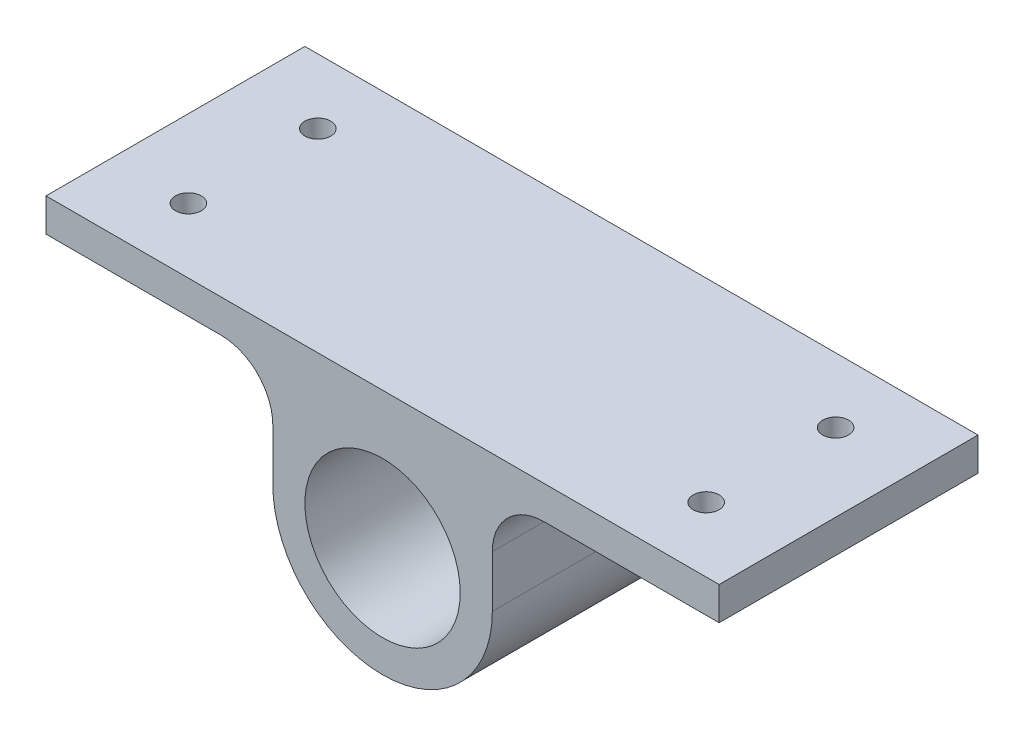
ISO-10303-21;
HEADER;
FILE_DESCRIPTION(('STEP AP214'),'2;1');
FILE_NAME('part.step','',(''),(''),'','','');
FILE_SCHEMA(('AUTOMOTIVE_DESIGN { 1 0 10303 214 1 1 1 1 }'));
ENDSEC;
DATA;
#1=APPLICATION_CONTEXT('core data for automotive mechanical design processes');
#2=APPLICATION_PROTOCOL_DEFINITION('international standard','automotive_design',2000,#1);
#3=PRODUCT_CONTEXT('',#1,'mechanical');
#4=PRODUCT('Part','Part','',(#3));
#5=PRODUCT_RELATED_PRODUCT_CATEGORY('part','',(#4));
#6=PRODUCT_DEFINITION_FORMATION('','',#4);
#7=PRODUCT_DEFINITION_CONTEXT('part definition',#1,'design');
#8=PRODUCT_DEFINITION('design','',#6,#7);
#9=PRODUCT_DEFINITION_SHAPE('','',#8);
#10=(LENGTH_UNIT() NAMED_UNIT(*) SI_UNIT(.MILLI.,.METRE.));
#11=(NAMED_UNIT(*) PLANE_ANGLE_UNIT() SI_UNIT($,.RADIAN.));
#12=(NAMED_UNIT(*) SI_UNIT($,.STERADIAN.) SOLID_ANGLE_UNIT());
#13=UNCERTAINTY_MEASURE_WITH_UNIT(LENGTH_MEASURE(1.E-05),#10,'distance_accuracy_value','');
#14=(GEOMETRIC_REPRESENTATION_CONTEXT(3) GLOBAL_UNCERTAINTY_ASSIGNED_CONTEXT((#13)) GLOBAL_UNIT_ASSIGNED_CONTEXT((#10,
#11,#12)) REPRESENTATION_CONTEXT('',''));
#15=CARTESIAN_POINT('',(0.,0.,0.));
#16=DIRECTION('',(0.,0.,1.));
#17=DIRECTION('',(1.,0.,0.));
#18=AXIS2_PLACEMENT_3D('',#15,#16,#17);
#19=CARTESIAN_POINT('',(0.,0.,125.));
#20=DIRECTION('',(0.,0.,1.));
#21=DIRECTION('',(1.,0.,0.));
#22=AXIS2_PLACEMENT_3D('',#19,#20,#21);
#23=PLANE('',#22);
#24=CARTESIAN_POINT('',(0.,0.,125.));
#25=DIRECTION('',(0.,0.,1.));
#26=DIRECTION('',(1.,0.,0.));
#27=AXIS2_PLACEMENT_3D('',#24,#25,#26);
#28=CIRCLE('',#27,106.);
#29=CARTESIAN_POINT('',(-106.,0.,125.));
#30=VERTEX_POINT('',#29);
#31=CARTESIAN_POINT('',(106.,1.11022302462516E-13,125.));
#32=VERTEX_POINT('',#31);
#33=EDGE_CURVE('E167',#30,#32,#28,.T.);
#34=ORIENTED_EDGE('',*,*,#33,.T.);
#35=DIRECTION('',(0.,1.,0.));
#36=VECTOR('',#35,1.);
#37=CARTESIAN_POINT('',(106.,1.11022302462516E-13,125.));
#38=LINE('',#37,#36);
#39=CARTESIAN_POINT('',(106.,50.0000000000001,125.));
#40=VERTEX_POINT('',#39);
#41=EDGE_CURVE('E105',#32,#40,#38,.T.);
#42=ORIENTED_EDGE('',*,*,#41,.T.);
#43=CARTESIAN_POINT('',(156.,50.0000000000001,125.));
#44=DIRECTION('',(0.,0.,-1.));
#45=DIRECTION('',(-1.,0.,0.));
#46=AXIS2_PLACEMENT_3D('',#43,#44,#45);
#47=CIRCLE('',#46,50.);
#48=CARTESIAN_POINT('',(156.,100.,125.));
#49=VERTEX_POINT('',#48);
#50=EDGE_CURVE('E215',#40,#49,#47,.T.);
#51=ORIENTED_EDGE('',*,*,#50,.T.);
#52=DIRECTION('',(1.,0.,0.));
#53=VECTOR('',#52,1.);
#54=CARTESIAN_POINT('',(156.,100.,125.));
#55=LINE('',#54,#53);
#56=CARTESIAN_POINT('',(325.,100.,125.));
#57=VERTEX_POINT('',#56);
#58=EDGE_CURVE('E217',#49,#57,#55,.T.);
#59=ORIENTED_EDGE('',*,*,#58,.T.);
#60=DIRECTION('',(0.,1.,0.));
#61=VECTOR('',#60,1.);
#62=CARTESIAN_POINT('',(325.,100.,125.));
#63=LINE('',#62,#61);
#64=CARTESIAN_POINT('',(325.,132.,125.));
#65=VERTEX_POINT('',#64);
#66=EDGE_CURVE('E219',#57,#65,#63,.T.);
#67=ORIENTED_EDGE('',*,*,#66,.T.);
#68=DIRECTION('',(-1.,0.,0.));
#69=VECTOR('',#68,1.);
#70=CARTESIAN_POINT('',(-325.,132.,125.));
#71=LINE('',#70,#69);
#72=CARTESIAN_POINT('',(-325.,132.,125.));
#73=VERTEX_POINT('',#72);
#74=EDGE_CURVE('E221',#65,#73,#71,.T.);
#75=ORIENTED_EDGE('',*,*,#74,.T.);
#76=DIRECTION('',(0.,-1.,0.));
#77=VECTOR('',#76,1.);
#78=CARTESIAN_POINT('',(-325.,100.,125.));
#79=LINE('',#78,#77);
#80=CARTESIAN_POINT('',(-325.,100.,125.));
#81=VERTEX_POINT('',#80);
#82=EDGE_CURVE('E130',#73,#81,#79,.T.);
#83=ORIENTED_EDGE('',*,*,#82,.T.);
#84=DIRECTION('',(1.,0.,0.));
#85=VECTOR('',#84,1.);
#86=CARTESIAN_POINT('',(-156.,100.,125.));
#87=LINE('',#86,#85);
#88=CARTESIAN_POINT('',(-156.,100.,125.));
#89=VERTEX_POINT('',#88);
#90=EDGE_CURVE('E124',#81,#89,#87,.T.);
#91=ORIENTED_EDGE('',*,*,#90,.T.);
#92=CARTESIAN_POINT('',(-156.,50.,125.));
#93=DIRECTION('',(0.,0.,-1.));
#94=DIRECTION('',(1.,0.,0.));
#95=AXIS2_PLACEMENT_3D('',#92,#93,#94);
#96=CIRCLE('',#95,50.);
#97=CARTESIAN_POINT('',(-106.,50.,125.));
#98=VERTEX_POINT('',#97);
#99=EDGE_CURVE('E128',#89,#98,#96,.T.);
#100=ORIENTED_EDGE('',*,*,#99,.T.);
#101=DIRECTION('',(0.,-1.,0.));
#102=VECTOR('',#101,1.);
#103=CARTESIAN_POINT('',(-106.,0.,125.));
#104=LINE('',#103,#102);
#105=EDGE_CURVE('E56',#98,#30,#104,.T.);
#106=ORIENTED_EDGE('',*,*,#105,.T.);
#107=EDGE_LOOP('',(#34,#42,#51,#59,#67,#75,#83,#91,#100,#106));
#108=FACE_BOUND('',#107,.T.);
#109=CARTESIAN_POINT('',(0.,0.,125.));
#110=DIRECTION('',(0.,0.,1.));
#111=DIRECTION('',(1.,0.,0.));
#112=AXIS2_PLACEMENT_3D('',#109,#110,#111);
#113=CIRCLE('',#112,75.);
#114=CARTESIAN_POINT('',(75.,0.,125.));
#115=VERTEX_POINT('',#114);
#116=EDGE_CURVE('E152',#115,#115,#113,.T.);
#117=ORIENTED_EDGE('',*,*,#116,.F.);
#118=EDGE_LOOP('',(#117));
#119=FACE_BOUND('',#118,.T.);
#120=ADVANCED_FACE('F37',(#108,#119),#23,.T.);
#121=CARTESIAN_POINT('',(0.,0.,-125.));
#122=DIRECTION('',(0.,0.,1.));
#123=DIRECTION('',(1.,0.,0.));
#124=AXIS2_PLACEMENT_3D('',#121,#122,#123);
#125=PLANE('',#124);
#126=CARTESIAN_POINT('',(0.,0.,-125.));
#127=DIRECTION('',(0.,0.,1.));
#128=DIRECTION('',(1.,0.,0.));
#129=AXIS2_PLACEMENT_3D('',#126,#127,#128);
#130=CIRCLE('',#129,106.);
#131=CARTESIAN_POINT('',(-106.,0.,-125.));
#132=VERTEX_POINT('',#131);
#133=CARTESIAN_POINT('',(106.,1.11022302462516E-13,-125.));
#134=VERTEX_POINT('',#133);
#135=EDGE_CURVE('E148',#132,#134,#130,.T.);
#136=ORIENTED_EDGE('',*,*,#135,.F.);
#137=DIRECTION('',(0.,-1.,0.));
#138=VECTOR('',#137,1.);
#139=CARTESIAN_POINT('',(-106.,0.,-125.));
#140=LINE('',#139,#138);
#141=CARTESIAN_POINT('',(-106.,50.,-125.));
#142=VERTEX_POINT('',#141);
#143=EDGE_CURVE('E97',#142,#132,#140,.T.);
#144=ORIENTED_EDGE('',*,*,#143,.F.);
#145=CARTESIAN_POINT('',(-156.,50.,-125.));
#146=DIRECTION('',(0.,0.,-1.));
#147=DIRECTION('',(1.,0.,0.));
#148=AXIS2_PLACEMENT_3D('',#145,#146,#147);
#149=CIRCLE('',#148,50.);
#150=CARTESIAN_POINT('',(-156.,100.,-125.));
#151=VERTEX_POINT('',#150);
#152=EDGE_CURVE('E91',#151,#142,#149,.T.);
#153=ORIENTED_EDGE('',*,*,#152,.F.);
#154=DIRECTION('',(1.,0.,0.));
#155=VECTOR('',#154,1.);
#156=CARTESIAN_POINT('',(-156.,100.,-125.));
#157=LINE('',#156,#155);
#158=CARTESIAN_POINT('',(-325.,100.,-125.));
#159=VERTEX_POINT('',#158);
#160=EDGE_CURVE('E138',#159,#151,#157,.T.);
#161=ORIENTED_EDGE('',*,*,#160,.F.);
#162=DIRECTION('',(0.,-1.,0.));
#163=VECTOR('',#162,1.);
#164=CARTESIAN_POINT('',(-325.,100.,-125.));
#165=LINE('',#164,#163);
#166=CARTESIAN_POINT('',(-325.,132.,-125.));
#167=VERTEX_POINT('',#166);
#168=EDGE_CURVE('E162',#167,#159,#165,.T.);
#169=ORIENTED_EDGE('',*,*,#168,.F.);
#170=DIRECTION('',(-1.,0.,0.));
#171=VECTOR('',#170,1.);
#172=CARTESIAN_POINT('',(-325.,132.,-125.));
#173=LINE('',#172,#171);
#174=CARTESIAN_POINT('',(325.,132.,-125.));
#175=VERTEX_POINT('',#174);
#176=EDGE_CURVE('E160',#175,#167,#173,.T.);
#177=ORIENTED_EDGE('',*,*,#176,.F.);
#178=DIRECTION('',(0.,1.,0.));
#179=VECTOR('',#178,1.);
#180=CARTESIAN_POINT('',(325.,100.,-125.));
#181=LINE('',#180,#179);
#182=CARTESIAN_POINT('',(325.,100.,-125.));
#183=VERTEX_POINT('',#182);
#184=EDGE_CURVE('E158',#183,#175,#181,.T.);
#185=ORIENTED_EDGE('',*,*,#184,.F.);
#186=DIRECTION('',(1.,0.,0.));
#187=VECTOR('',#186,1.);
#188=CARTESIAN_POINT('',(156.,100.,-125.));
#189=LINE('',#188,#187);
#190=CARTESIAN_POINT('',(156.,100.,-125.));
#191=VERTEX_POINT('',#190);
#192=EDGE_CURVE('E156',#191,#183,#189,.T.);
#193=ORIENTED_EDGE('',*,*,#192,.F.);
#194=CARTESIAN_POINT('',(156.,50.0000000000001,-125.));
#195=DIRECTION('',(0.,0.,-1.));
#196=DIRECTION('',(-1.,0.,0.));
#197=AXIS2_PLACEMENT_3D('',#194,#195,#196);
#198=CIRCLE('',#197,50.);
#199=CARTESIAN_POINT('',(106.,50.0000000000001,-125.));
#200=VERTEX_POINT('',#199);
#201=EDGE_CURVE('E154',#200,#191,#198,.T.);
#202=ORIENTED_EDGE('',*,*,#201,.F.);
#203=DIRECTION('',(0.,1.,0.));
#204=VECTOR('',#203,1.);
#205=CARTESIAN_POINT('',(106.,1.11022302462516E-13,-125.));
#206=LINE('',#205,#204);
#207=EDGE_CURVE('E151',#134,#200,#206,.T.);
#208=ORIENTED_EDGE('',*,*,#207,.F.);
#209=EDGE_LOOP('',(#136,#144,#153,#161,#169,#177,#185,#193,#202,#208));
#210=FACE_BOUND('',#209,.T.);
#211=CARTESIAN_POINT('',(0.,0.,-125.));
#212=DIRECTION('',(0.,0.,1.));
#213=DIRECTION('',(1.,0.,0.));
#214=AXIS2_PLACEMENT_3D('',#211,#212,#213);
#215=CIRCLE('',#214,75.);
#216=CARTESIAN_POINT('',(75.,0.,-125.));
#217=VERTEX_POINT('',#216);
#218=EDGE_CURVE('E208',#217,#217,#215,.T.);
#219=ORIENTED_EDGE('',*,*,#218,.T.);
#220=EDGE_LOOP('',(#219));
#221=FACE_BOUND('',#220,.T.);
#222=ADVANCED_FACE('F234',(#210,#221),#125,.F.);
#223=CARTESIAN_POINT('',(0.,0.,125.));
#224=DIRECTION('',(0.,0.,-1.));
#225=DIRECTION('',(-1.,0.,0.));
#226=AXIS2_PLACEMENT_3D('',#223,#224,#225);
#227=CYLINDRICAL_SURFACE('',#226,106.);
#228=ORIENTED_EDGE('',*,*,#135,.T.);
#229=DIRECTION('',(0.,0.,-1.));
#230=VECTOR('',#229,1.);
#231=CARTESIAN_POINT('',(106.,1.11022302462516E-13,125.));
#232=LINE('',#231,#230);
#233=EDGE_CURVE('E11',#32,#134,#232,.T.);
#234=ORIENTED_EDGE('',*,*,#233,.F.);
#235=ORIENTED_EDGE('',*,*,#33,.F.);
#236=DIRECTION('',(0.,0.,-1.));
#237=VECTOR('',#236,1.);
#238=CARTESIAN_POINT('',(-106.,0.,125.));
#239=LINE('',#238,#237);
#240=EDGE_CURVE('E144',#30,#132,#239,.T.);
#241=ORIENTED_EDGE('',*,*,#240,.T.);
#242=EDGE_LOOP('',(#228,#234,#235,#241));
#243=FACE_BOUND('',#242,.T.);
#244=ADVANCED_FACE('F39',(#243),#227,.T.);
#245=CARTESIAN_POINT('',(106.,1.11022302462516E-13,125.));
#246=DIRECTION('',(-1.,0.,0.));
#247=DIRECTION('',(0.,-1.,0.));
#248=AXIS2_PLACEMENT_3D('',#245,#246,#247);
#249=PLANE('',#248);
#250=ORIENTED_EDGE('',*,*,#207,.T.);
#251=DIRECTION('',(0.,0.,-1.));
#252=VECTOR('',#251,1.);
#253=CARTESIAN_POINT('',(106.,50.0000000000001,125.));
#254=LINE('',#253,#252);
#255=EDGE_CURVE('E47',#40,#200,#254,.T.);
#256=ORIENTED_EDGE('',*,*,#255,.F.);
#257=ORIENTED_EDGE('',*,*,#41,.F.);
#258=ORIENTED_EDGE('',*,*,#233,.T.);
#259=EDGE_LOOP('',(#250,#256,#257,#258));
#260=FACE_BOUND('',#259,.T.);
#261=ADVANCED_FACE('F301',(#260),#249,.F.);
#262=CARTESIAN_POINT('',(156.,50.0000000000001,125.));
#263=DIRECTION('',(0.,0.,-1.));
#264=DIRECTION('',(-1.,0.,0.));
#265=AXIS2_PLACEMENT_3D('',#262,#263,#264);
#266=CYLINDRICAL_SURFACE('',#265,50.);
#267=ORIENTED_EDGE('',*,*,#201,.T.);
#268=DIRECTION('',(0.,0.,-1.));
#269=VECTOR('',#268,1.);
#270=CARTESIAN_POINT('',(156.,100.,125.));
#271=LINE('',#270,#269);
#272=EDGE_CURVE('E180',#49,#191,#271,.T.);
#273=ORIENTED_EDGE('',*,*,#272,.F.);
#274=ORIENTED_EDGE('',*,*,#50,.F.);
#275=ORIENTED_EDGE('',*,*,#255,.T.);
#276=EDGE_LOOP('',(#267,#273,#274,#275));
#277=FACE_BOUND('',#276,.T.);
#278=ADVANCED_FACE('F282',(#277),#266,.F.);
#279=CARTESIAN_POINT('',(156.,100.,125.));
#280=DIRECTION('',(0.,1.,0.));
#281=DIRECTION('',(0.,0.,1.));
#282=AXIS2_PLACEMENT_3D('',#279,#280,#281);
#283=PLANE('',#282);
#284=CARTESIAN_POINT('',(250.,100.,62.5));
#285=DIRECTION('',(0.,1.,0.));
#286=DIRECTION('',(0.,0.,1.));
#287=AXIS2_PLACEMENT_3D('',#284,#285,#286);
#288=CIRCLE('',#287,12.5);
#289=CARTESIAN_POINT('',(250.,100.,75.));
#290=VERTEX_POINT('',#289);
#291=EDGE_CURVE('E205',#290,#290,#288,.T.);
#292=ORIENTED_EDGE('',*,*,#291,.T.);
#293=EDGE_LOOP('',(#292));
#294=FACE_BOUND('',#293,.T.);
#295=CARTESIAN_POINT('',(250.,100.,-62.5));
#296=DIRECTION('',(0.,1.,0.));
#297=DIRECTION('',(0.,0.,1.));
#298=AXIS2_PLACEMENT_3D('',#295,#296,#297);
#299=CIRCLE('',#298,12.5);
#300=CARTESIAN_POINT('',(250.,100.,-50.));
#301=VERTEX_POINT('',#300);
#302=EDGE_CURVE('E190',#301,#301,#299,.T.);
#303=ORIENTED_EDGE('',*,*,#302,.T.);
#304=EDGE_LOOP('',(#303));
#305=FACE_BOUND('',#304,.T.);
#306=ORIENTED_EDGE('',*,*,#192,.T.);
#307=DIRECTION('',(0.,0.,-1.));
#308=VECTOR('',#307,1.);
#309=CARTESIAN_POINT('',(325.,100.,125.));
#310=LINE('',#309,#308);
#311=EDGE_CURVE('E177',#57,#183,#310,.T.);
#312=ORIENTED_EDGE('',*,*,#311,.F.);
#313=ORIENTED_EDGE('',*,*,#58,.F.);
#314=ORIENTED_EDGE('',*,*,#272,.T.);
#315=EDGE_LOOP('',(#306,#312,#313,#314));
#316=FACE_BOUND('',#315,.T.);
#317=ADVANCED_FACE('F278',(#294,#305,#316),#283,.F.);
#318=CARTESIAN_POINT('',(325.,100.,125.));
#319=DIRECTION('',(-1.,0.,0.));
#320=DIRECTION('',(0.,0.,1.));
#321=AXIS2_PLACEMENT_3D('',#318,#319,#320);
#322=PLANE('',#321);
#323=ORIENTED_EDGE('',*,*,#184,.T.);
#324=DIRECTION('',(0.,0.,-1.));
#325=VECTOR('',#324,1.);
#326=CARTESIAN_POINT('',(325.,132.,125.));
#327=LINE('',#326,#325);
#328=EDGE_CURVE('E174',#65,#175,#327,.T.);
#329=ORIENTED_EDGE('',*,*,#328,.F.);
#330=ORIENTED_EDGE('',*,*,#66,.F.);
#331=ORIENTED_EDGE('',*,*,#311,.T.);
#332=EDGE_LOOP('',(#323,#329,#330,#331));
#333=FACE_BOUND('',#332,.T.);
#334=ADVANCED_FACE('F281',(#333),#322,.F.);
#335=CARTESIAN_POINT('',(-325.,132.,125.));
#336=DIRECTION('',(0.,-1.,0.));
#337=DIRECTION('',(1.,0.,0.));
#338=AXIS2_PLACEMENT_3D('',#335,#336,#337);
#339=PLANE('',#338);
#340=CARTESIAN_POINT('',(-250.,132.,62.5));
#341=DIRECTION('',(0.,1.,0.));
#342=DIRECTION('',(1.,0.,0.));
#343=AXIS2_PLACEMENT_3D('',#340,#341,#342);
#344=CIRCLE('',#343,12.5);
#345=CARTESIAN_POINT('',(-237.5,132.,62.5));
#346=VERTEX_POINT('',#345);
#347=EDGE_CURVE('E201',#346,#346,#344,.T.);
#348=ORIENTED_EDGE('',*,*,#347,.F.);
#349=EDGE_LOOP('',(#348));
#350=FACE_BOUND('',#349,.T.);
#351=CARTESIAN_POINT('',(250.,132.,62.5));
#352=DIRECTION('',(0.,1.,0.));
#353=DIRECTION('',(-1.,0.,0.));
#354=AXIS2_PLACEMENT_3D('',#351,#352,#353);
#355=CIRCLE('',#354,12.5);
#356=CARTESIAN_POINT('',(237.5,132.,62.5));
#357=VERTEX_POINT('',#356);
#358=EDGE_CURVE('E197',#357,#357,#355,.T.);
#359=ORIENTED_EDGE('',*,*,#358,.F.);
#360=EDGE_LOOP('',(#359));
#361=FACE_BOUND('',#360,.T.);
#362=CARTESIAN_POINT('',(250.,132.,-62.5));
#363=DIRECTION('',(0.,1.,0.));
#364=DIRECTION('',(1.,0.,0.));
#365=AXIS2_PLACEMENT_3D('',#362,#363,#364);
#366=CIRCLE('',#365,12.5);
#367=CARTESIAN_POINT('',(262.5,132.,-62.5));
#368=VERTEX_POINT('',#367);
#369=EDGE_CURVE('E192',#368,#368,#366,.T.);
#370=ORIENTED_EDGE('',*,*,#369,.F.);
#371=EDGE_LOOP('',(#370));
#372=FACE_BOUND('',#371,.T.);
#373=CARTESIAN_POINT('',(-250.,132.,-62.5));
#374=DIRECTION('',(0.,1.,0.));
#375=DIRECTION('',(-1.,0.,0.));
#376=AXIS2_PLACEMENT_3D('',#373,#374,#375);
#377=CIRCLE('',#376,12.5);
#378=CARTESIAN_POINT('',(-262.5,132.,-62.5));
#379=VERTEX_POINT('',#378);
#380=EDGE_CURVE('E186',#379,#379,#377,.T.);
#381=ORIENTED_EDGE('',*,*,#380,.F.);
#382=EDGE_LOOP('',(#381));
#383=FACE_BOUND('',#382,.T.);
#384=ORIENTED_EDGE('',*,*,#176,.T.);
#385=DIRECTION('',(0.,0.,-1.));
#386=VECTOR('',#385,1.);
#387=CARTESIAN_POINT('',(-325.,132.,125.));
#388=LINE('',#387,#386);
#389=EDGE_CURVE('E171',#73,#167,#388,.T.);
#390=ORIENTED_EDGE('',*,*,#389,.F.);
#391=ORIENTED_EDGE('',*,*,#74,.F.);
#392=ORIENTED_EDGE('',*,*,#328,.T.);
#393=EDGE_LOOP('',(#384,#390,#391,#392));
#394=FACE_BOUND('',#393,.T.);
#395=ADVANCED_FACE('F227',(#350,#361,#372,#383,#394),#339,.F.);
#396=CARTESIAN_POINT('',(-325.,100.,125.));
#397=DIRECTION('',(1.,0.,0.));
#398=DIRECTION('',(0.,0.,-1.));
#399=AXIS2_PLACEMENT_3D('',#396,#397,#398);
#400=PLANE('',#399);
#401=ORIENTED_EDGE('',*,*,#168,.T.);
#402=DIRECTION('',(0.,0.,-1.));
#403=VECTOR('',#402,1.);
#404=CARTESIAN_POINT('',(-325.,100.,125.));
#405=LINE('',#404,#403);
#406=EDGE_CURVE('E139',#81,#159,#405,.T.);
#407=ORIENTED_EDGE('',*,*,#406,.F.);
#408=ORIENTED_EDGE('',*,*,#82,.F.);
#409=ORIENTED_EDGE('',*,*,#389,.T.);
#410=EDGE_LOOP('',(#401,#407,#408,#409));
#411=FACE_BOUND('',#410,.T.);
#412=ADVANCED_FACE('F231',(#411),#400,.F.);
#413=CARTESIAN_POINT('',(-156.,100.,125.));
#414=DIRECTION('',(0.,1.,0.));
#415=DIRECTION('',(-1.,0.,0.));
#416=AXIS2_PLACEMENT_3D('',#413,#414,#415);
#417=PLANE('',#416);
#418=CARTESIAN_POINT('',(-250.,100.,62.5));
#419=DIRECTION('',(0.,1.,0.));
#420=DIRECTION('',(-1.,0.,0.));
#421=AXIS2_PLACEMENT_3D('',#418,#419,#420);
#422=CIRCLE('',#421,12.5);
#423=CARTESIAN_POINT('',(-262.5,100.,62.5));
#424=VERTEX_POINT('',#423);
#425=EDGE_CURVE('E41',#424,#424,#422,.T.);
#426=ORIENTED_EDGE('',*,*,#425,.T.);
#427=EDGE_LOOP('',(#426));
#428=FACE_BOUND('',#427,.T.);
#429=CARTESIAN_POINT('',(-250.,100.,-62.5));
#430=DIRECTION('',(0.,1.,0.));
#431=DIRECTION('',(-1.,0.,0.));
#432=AXIS2_PLACEMENT_3D('',#429,#430,#431);
#433=CIRCLE('',#432,12.5);
#434=CARTESIAN_POINT('',(-262.5,100.,-62.5));
#435=VERTEX_POINT('',#434);
#436=EDGE_CURVE('E184',#435,#435,#433,.T.);
#437=ORIENTED_EDGE('',*,*,#436,.T.);
#438=EDGE_LOOP('',(#437));
#439=FACE_BOUND('',#438,.T.);
#440=ORIENTED_EDGE('',*,*,#160,.T.);
#441=DIRECTION('',(0.,0.,-1.));
#442=VECTOR('',#441,1.);
#443=CARTESIAN_POINT('',(-156.,100.,125.));
#444=LINE('',#443,#442);
#445=EDGE_CURVE('E135',#89,#151,#444,.T.);
#446=ORIENTED_EDGE('',*,*,#445,.F.);
#447=ORIENTED_EDGE('',*,*,#90,.F.);
#448=ORIENTED_EDGE('',*,*,#406,.T.);
#449=EDGE_LOOP('',(#440,#446,#447,#448));
#450=FACE_BOUND('',#449,.T.);
#451=ADVANCED_FACE('F136',(#428,#439,#450),#417,.F.);
#452=CARTESIAN_POINT('',(-156.,50.,125.));
#453=DIRECTION('',(0.,0.,-1.));
#454=DIRECTION('',(-1.,0.,0.));
#455=AXIS2_PLACEMENT_3D('',#452,#453,#454);
#456=CYLINDRICAL_SURFACE('',#455,50.);
#457=ORIENTED_EDGE('',*,*,#152,.T.);
#458=DIRECTION('',(0.,0.,-1.));
#459=VECTOR('',#458,1.);
#460=CARTESIAN_POINT('',(-106.,50.,125.));
#461=LINE('',#460,#459);
#462=EDGE_CURVE('E140',#98,#142,#461,.T.);
#463=ORIENTED_EDGE('',*,*,#462,.F.);
#464=ORIENTED_EDGE('',*,*,#99,.F.);
#465=ORIENTED_EDGE('',*,*,#445,.T.);
#466=EDGE_LOOP('',(#457,#463,#464,#465));
#467=FACE_BOUND('',#466,.T.);
#468=ADVANCED_FACE('F142',(#467),#456,.F.);
#469=CARTESIAN_POINT('',(-106.,0.,125.));
#470=DIRECTION('',(1.,0.,0.));
#471=DIRECTION('',(0.,0.,-1.));
#472=AXIS2_PLACEMENT_3D('',#469,#470,#471);
#473=PLANE('',#472);
#474=ORIENTED_EDGE('',*,*,#143,.T.);
#475=ORIENTED_EDGE('',*,*,#240,.F.);
#476=ORIENTED_EDGE('',*,*,#105,.F.);
#477=ORIENTED_EDGE('',*,*,#462,.T.);
#478=EDGE_LOOP('',(#474,#475,#476,#477));
#479=FACE_BOUND('',#478,.T.);
#480=ADVANCED_FACE('F240',(#479),#473,.F.);
#481=CARTESIAN_POINT('',(0.,0.,125.));
#482=DIRECTION('',(0.,0.,-1.));
#483=DIRECTION('',(-1.,0.,0.));
#484=AXIS2_PLACEMENT_3D('',#481,#482,#483);
#485=CYLINDRICAL_SURFACE('',#484,75.);
#486=ORIENTED_EDGE('',*,*,#116,.T.);
#487=EDGE_LOOP('',(#486));
#488=FACE_BOUND('',#487,.T.);
#489=ORIENTED_EDGE('',*,*,#218,.F.);
#490=EDGE_LOOP('',(#489));
#491=FACE_BOUND('',#490,.T.);
#492=ADVANCED_FACE('F242',(#488,#491),#485,.F.);
#493=CARTESIAN_POINT('',(-250.,-106.,-62.5));
#494=DIRECTION('',(0.,1.,0.));
#495=DIRECTION('',(-1.,0.,0.));
#496=AXIS2_PLACEMENT_3D('',#493,#494,#495);
#497=CYLINDRICAL_SURFACE('',#496,12.5);
#498=ORIENTED_EDGE('',*,*,#380,.T.);
#499=EDGE_LOOP('',(#498));
#500=FACE_BOUND('',#499,.T.);
#501=ORIENTED_EDGE('',*,*,#436,.F.);
#502=EDGE_LOOP('',(#501));
#503=FACE_BOUND('',#502,.T.);
#504=ADVANCED_FACE('F248',(#500,#503),#497,.F.);
#505=CARTESIAN_POINT('',(-250.,-106.,62.5));
#506=DIRECTION('',(0.,1.,0.));
#507=DIRECTION('',(-1.,0.,0.));
#508=AXIS2_PLACEMENT_3D('',#505,#506,#507);
#509=CYLINDRICAL_SURFACE('',#508,12.5);
#510=ORIENTED_EDGE('',*,*,#347,.T.);
#511=EDGE_LOOP('',(#510));
#512=FACE_BOUND('',#511,.T.);
#513=ORIENTED_EDGE('',*,*,#425,.F.);
#514=EDGE_LOOP('',(#513));
#515=FACE_BOUND('',#514,.T.);
#516=ADVANCED_FACE('F261',(#512,#515),#509,.F.);
#517=CARTESIAN_POINT('',(250.,-106.,-62.5));
#518=DIRECTION('',(0.,1.,0.));
#519=DIRECTION('',(-1.,0.,0.));
#520=AXIS2_PLACEMENT_3D('',#517,#518,#519);
#521=CYLINDRICAL_SURFACE('',#520,12.5);
#522=ORIENTED_EDGE('',*,*,#369,.T.);
#523=EDGE_LOOP('',(#522));
#524=FACE_BOUND('',#523,.T.);
#525=ORIENTED_EDGE('',*,*,#302,.F.);
#526=EDGE_LOOP('',(#525));
#527=FACE_BOUND('',#526,.T.);
#528=ADVANCED_FACE('F264',(#524,#527),#521,.F.);
#529=CARTESIAN_POINT('',(250.,-106.,62.5));
#530=DIRECTION('',(0.,1.,0.));
#531=DIRECTION('',(-1.,0.,0.));
#532=AXIS2_PLACEMENT_3D('',#529,#530,#531);
#533=CYLINDRICAL_SURFACE('',#532,12.5);
#534=ORIENTED_EDGE('',*,*,#358,.T.);
#535=EDGE_LOOP('',(#534));
#536=FACE_BOUND('',#535,.T.);
#537=ORIENTED_EDGE('',*,*,#291,.F.);
#538=EDGE_LOOP('',(#537));
#539=FACE_BOUND('',#538,.T.);
#540=ADVANCED_FACE('F266',(#536,#539),#533,.F.);
#541=CLOSED_SHELL('',(#120,#222,#244,#261,#278,#317,#334,#395,#412,#451,#468,#480,#492,#504,
#516,#528,#540));
#542=MANIFOLD_SOLID_BREP('B2',#541);
#543=ADVANCED_BREP_SHAPE_REPRESENTATION('',(#18,#542),#14);
#544=SHAPE_DEFINITION_REPRESENTATION(#9,#543);
ENDSEC;
END-ISO-10303-21;
